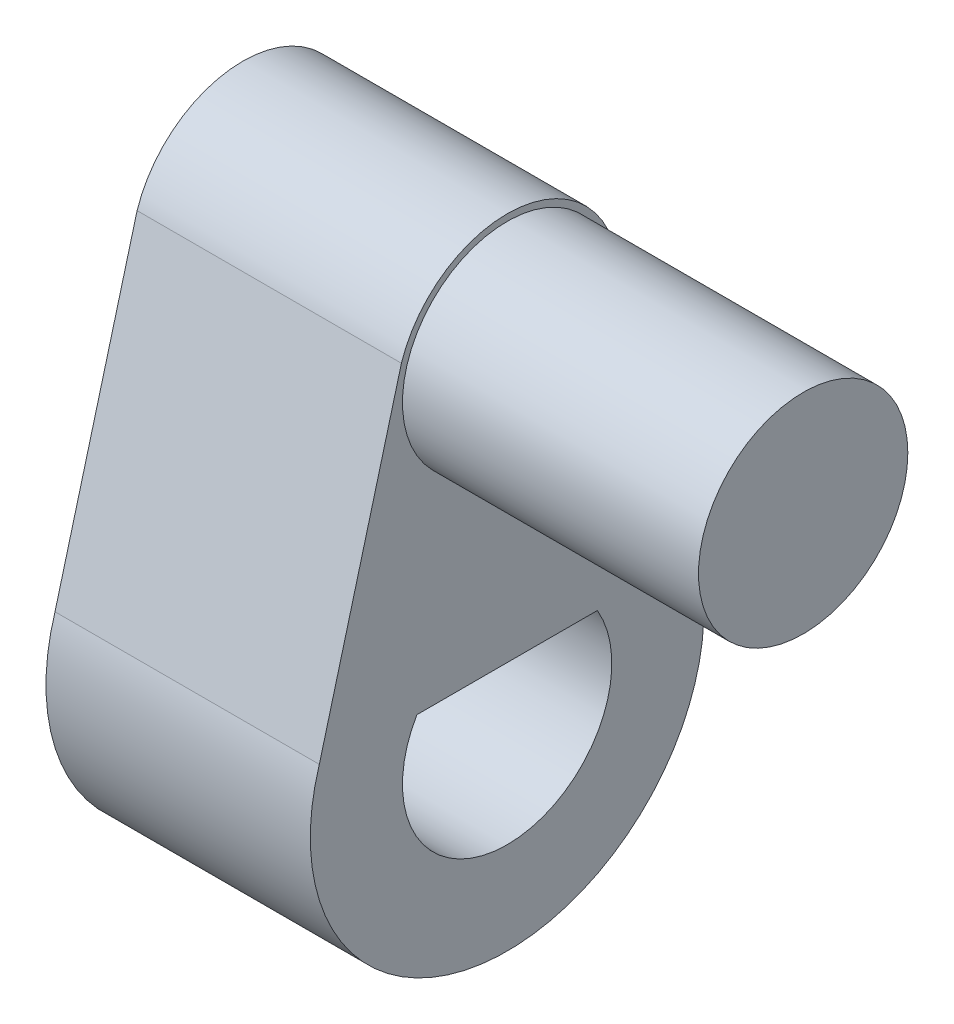
ISO-10303-21;
HEADER;
FILE_DESCRIPTION(('STEP AP214'),'2;1');
FILE_NAME('part.step','',(''),(''),'','','');
FILE_SCHEMA(('AUTOMOTIVE_DESIGN { 1 0 10303 214 1 1 1 1 }'));
ENDSEC;
DATA;
#1=APPLICATION_CONTEXT('core data for automotive mechanical design processes');
#2=APPLICATION_PROTOCOL_DEFINITION('international standard','automotive_design',2000,#1);
#3=PRODUCT_CONTEXT('',#1,'mechanical');
#4=PRODUCT('Part','Part','',(#3));
#5=PRODUCT_RELATED_PRODUCT_CATEGORY('part','',(#4));
#6=PRODUCT_DEFINITION_FORMATION('','',#4);
#7=PRODUCT_DEFINITION_CONTEXT('part definition',#1,'design');
#8=PRODUCT_DEFINITION('design','',#6,#7);
#9=PRODUCT_DEFINITION_SHAPE('','',#8);
#10=(LENGTH_UNIT() NAMED_UNIT(*) SI_UNIT(.MILLI.,.METRE.));
#11=(NAMED_UNIT(*) PLANE_ANGLE_UNIT() SI_UNIT($,.RADIAN.));
#12=(NAMED_UNIT(*) SI_UNIT($,.STERADIAN.) SOLID_ANGLE_UNIT());
#13=UNCERTAINTY_MEASURE_WITH_UNIT(LENGTH_MEASURE(1.E-05),#10,'distance_accuracy_value','');
#14=(GEOMETRIC_REPRESENTATION_CONTEXT(3) GLOBAL_UNCERTAINTY_ASSIGNED_CONTEXT((#13)) GLOBAL_UNIT_ASSIGNED_CONTEXT((#10,
#11,#12)) REPRESENTATION_CONTEXT('',''));
#15=CARTESIAN_POINT('',(0.,0.,0.));
#16=DIRECTION('',(0.,0.,1.));
#17=DIRECTION('',(1.,0.,0.));
#18=AXIS2_PLACEMENT_3D('',#15,#16,#17);
#19=CARTESIAN_POINT('',(2.5,30.6404275633658,53.6707737399797));
#20=DIRECTION('',(-1.,0.,0.));
#21=DIRECTION('',(0.,0.,1.));
#22=AXIS2_PLACEMENT_3D('',#19,#20,#21);
#23=CYLINDRICAL_SURFACE('',#22,1.05254228826987);
#24=CARTESIAN_POINT('',(0.,30.6404275633658,53.6707737399797));
#25=DIRECTION('',(1.,0.,0.));
#26=DIRECTION('',(0.,0.,-1.));
#27=AXIS2_PLACEMENT_3D('',#24,#25,#26);
#28=CIRCLE('',#27,1.05254228826987);
#29=CARTESIAN_POINT('',(0.,30.9688255971547,52.6707737399797));
#30=VERTEX_POINT('',#29);
#31=CARTESIAN_POINT('',(0.,30.9688255971547,54.6707737399797));
#32=VERTEX_POINT('',#31);
#33=EDGE_CURVE('E117',#30,#32,#28,.T.);
#34=ORIENTED_EDGE('',*,*,#33,.T.);
#35=DIRECTION('',(-1.,0.,0.));
#36=VECTOR('',#35,1.);
#37=CARTESIAN_POINT('',(2.5,30.9688255971547,54.6707737399797));
#38=LINE('',#37,#36);
#39=CARTESIAN_POINT('',(2.5,30.9688255971547,54.6707737399797));
#40=VERTEX_POINT('',#39);
#41=EDGE_CURVE('E107',#40,#32,#38,.T.);
#42=ORIENTED_EDGE('',*,*,#41,.F.);
#43=CARTESIAN_POINT('',(2.5,30.6404275633658,53.6707737399797));
#44=DIRECTION('',(1.,0.,0.));
#45=DIRECTION('',(0.,0.,-1.));
#46=AXIS2_PLACEMENT_3D('',#43,#44,#45);
#47=CIRCLE('',#46,1.05254228826987);
#48=CARTESIAN_POINT('',(2.5,30.9688255971547,52.6707737399797));
#49=VERTEX_POINT('',#48);
#50=EDGE_CURVE('E127',#49,#40,#47,.T.);
#51=ORIENTED_EDGE('',*,*,#50,.F.);
#52=DIRECTION('',(-1.,0.,0.));
#53=VECTOR('',#52,1.);
#54=CARTESIAN_POINT('',(2.5,30.9688255971547,52.6707737399797));
#55=LINE('',#54,#53);
#56=EDGE_CURVE('E136',#49,#30,#55,.T.);
#57=ORIENTED_EDGE('',*,*,#56,.T.);
#58=EDGE_LOOP('',(#34,#42,#51,#57));
#59=FACE_BOUND('',#58,.T.);
#60=ADVANCED_FACE('F36',(#59),#23,.T.);
#61=CARTESIAN_POINT('',(2.5,30.9688255971547,54.6707737399797));
#62=DIRECTION('',(0.,-0.258819045102522,-0.965925826289068));
#63=DIRECTION('',(0.,0.965925826289068,-0.258819045102522));
#64=AXIS2_PLACEMENT_3D('',#61,#62,#63);
#65=PLANE('',#64);
#66=DIRECTION('',(0.,-0.965925826289068,0.258819045102522));
#67=VECTOR('',#66,1.);
#68=CARTESIAN_POINT('',(0.,30.9688255971547,54.6707737399797));
#69=LINE('',#68,#67);
#70=CARTESIAN_POINT('',(0.,28.0710481182874,55.4472308752873));
#71=VERTEX_POINT('',#70);
#72=EDGE_CURVE('E121',#32,#71,#69,.T.);
#73=ORIENTED_EDGE('',*,*,#72,.T.);
#74=DIRECTION('',(-1.,0.,0.));
#75=VECTOR('',#74,1.);
#76=CARTESIAN_POINT('',(2.5,28.0710481182874,55.4472308752873));
#77=LINE('',#76,#75);
#78=CARTESIAN_POINT('',(2.5,28.0710481182874,55.4472308752873));
#79=VERTEX_POINT('',#78);
#80=EDGE_CURVE('E147',#79,#71,#77,.T.);
#81=ORIENTED_EDGE('',*,*,#80,.F.);
#82=DIRECTION('',(0.,-0.965925826289068,0.258819045102522));
#83=VECTOR('',#82,1.);
#84=CARTESIAN_POINT('',(2.5,30.9688255971547,54.6707737399797));
#85=LINE('',#84,#83);
#86=EDGE_CURVE('E130',#40,#79,#85,.T.);
#87=ORIENTED_EDGE('',*,*,#86,.F.);
#88=ORIENTED_EDGE('',*,*,#41,.T.);
#89=EDGE_LOOP('',(#73,#81,#87,#88));
#90=FACE_BOUND('',#89,.T.);
#91=ADVANCED_FACE('F171',(#90),#65,.F.);
#92=CARTESIAN_POINT('',(2.5,27.5141959960999,53.6707737399797));
#93=DIRECTION('',(-1.,0.,0.));
#94=DIRECTION('',(0.,0.,1.));
#95=AXIS2_PLACEMENT_3D('',#92,#93,#94);
#96=CYLINDRICAL_SURFACE('',#95,1.86168854526473);
#97=CARTESIAN_POINT('',(0.,27.5141959960999,53.6707737399797));
#98=DIRECTION('',(1.,0.,0.));
#99=DIRECTION('',(0.,0.,-1.));
#100=AXIS2_PLACEMENT_3D('',#97,#98,#99);
#101=CIRCLE('',#100,1.86168854526473);
#102=CARTESIAN_POINT('',(0.,28.0710481182874,51.8943166046722));
#103=VERTEX_POINT('',#102);
#104=EDGE_CURVE('E139',#71,#103,#101,.T.);
#105=ORIENTED_EDGE('',*,*,#104,.T.);
#106=DIRECTION('',(-1.,0.,0.));
#107=VECTOR('',#106,1.);
#108=CARTESIAN_POINT('',(2.5,28.0710481182874,51.8943166046722));
#109=LINE('',#108,#107);
#110=CARTESIAN_POINT('',(2.5,28.0710481182874,51.8943166046722));
#111=VERTEX_POINT('',#110);
#112=EDGE_CURVE('E144',#111,#103,#109,.T.);
#113=ORIENTED_EDGE('',*,*,#112,.F.);
#114=CARTESIAN_POINT('',(2.5,27.5141959960999,53.6707737399797));
#115=DIRECTION('',(1.,0.,0.));
#116=DIRECTION('',(0.,0.,-1.));
#117=AXIS2_PLACEMENT_3D('',#114,#115,#116);
#118=CIRCLE('',#117,1.86168854526473);
#119=EDGE_CURVE('E133',#79,#111,#118,.T.);
#120=ORIENTED_EDGE('',*,*,#119,.F.);
#121=ORIENTED_EDGE('',*,*,#80,.T.);
#122=EDGE_LOOP('',(#105,#113,#120,#121));
#123=FACE_BOUND('',#122,.T.);
#124=ADVANCED_FACE('F175',(#123),#96,.T.);
#125=CARTESIAN_POINT('',(2.5,30.9688255971547,52.6707737399797));
#126=DIRECTION('',(0.,-0.258819045102522,0.965925826289068));
#127=DIRECTION('',(0.,-0.965925826289068,-0.258819045102522));
#128=AXIS2_PLACEMENT_3D('',#125,#126,#127);
#129=PLANE('',#128);
#130=DIRECTION('',(0.,0.965925826289068,0.258819045102522));
#131=VECTOR('',#130,1.);
#132=CARTESIAN_POINT('',(0.,30.9688255971547,52.6707737399797));
#133=LINE('',#132,#131);
#134=EDGE_CURVE('E131',#103,#30,#133,.T.);
#135=ORIENTED_EDGE('',*,*,#134,.T.);
#136=ORIENTED_EDGE('',*,*,#56,.F.);
#137=DIRECTION('',(0.,0.965925826289068,0.258819045102522));
#138=VECTOR('',#137,1.);
#139=CARTESIAN_POINT('',(2.5,30.9688255971547,52.6707737399797));
#140=LINE('',#139,#138);
#141=EDGE_CURVE('E135',#111,#49,#140,.T.);
#142=ORIENTED_EDGE('',*,*,#141,.F.);
#143=ORIENTED_EDGE('',*,*,#112,.T.);
#144=EDGE_LOOP('',(#135,#136,#142,#143));
#145=FACE_BOUND('',#144,.T.);
#146=ADVANCED_FACE('F179',(#145),#129,.F.);
#147=CARTESIAN_POINT('',(2.5,30.6404275633658,53.6707737399797));
#148=DIRECTION('',(1.,0.,0.));
#149=DIRECTION('',(0.,0.,-1.));
#150=AXIS2_PLACEMENT_3D('',#147,#148,#149);
#151=PLANE('',#150);
#152=CARTESIAN_POINT('',(2.5,27.5141959960997,53.6707737399798));
#153=DIRECTION('',(1.,0.,0.));
#154=DIRECTION('',(0.,0.,-1.));
#155=AXIS2_PLACEMENT_3D('',#152,#153,#154);
#156=CIRCLE('',#155,0.989999999999993);
#157=CARTESIAN_POINT('',(2.5,28.0163959156241,54.5239415082585));
#158=VERTEX_POINT('',#157);
#159=CARTESIAN_POINT('',(2.5,28.0163959156241,52.8176059717011));
#160=VERTEX_POINT('',#159);
#161=EDGE_CURVE('E105',#158,#160,#156,.T.);
#162=ORIENTED_EDGE('',*,*,#161,.F.);
#163=DIRECTION('',(0.,0.,-1.));
#164=VECTOR('',#163,1.);
#165=CARTESIAN_POINT('',(2.5,28.0163959156241,54.6674353176535));
#166=LINE('',#165,#164);
#167=EDGE_CURVE('E110',#158,#160,#166,.T.);
#168=ORIENTED_EDGE('',*,*,#167,.T.);
#169=EDGE_LOOP('',(#162,#168));
#170=FACE_BOUND('',#169,.T.);
#171=CARTESIAN_POINT('',(2.5,30.6404275633658,53.6707737399797));
#172=DIRECTION('',(1.,0.,0.));
#173=DIRECTION('',(0.,0.,-1.));
#174=AXIS2_PLACEMENT_3D('',#171,#172,#173);
#175=CIRCLE('',#174,0.990000000000001);
#176=CARTESIAN_POINT('',(2.5,30.6404275633658,52.6807737399797));
#177=VERTEX_POINT('',#176);
#178=EDGE_CURVE('E113',#177,#177,#175,.T.);
#179=ORIENTED_EDGE('',*,*,#178,.F.);
#180=EDGE_LOOP('',(#179));
#181=FACE_BOUND('',#180,.T.);
#182=ORIENTED_EDGE('',*,*,#50,.T.);
#183=ORIENTED_EDGE('',*,*,#86,.T.);
#184=ORIENTED_EDGE('',*,*,#119,.T.);
#185=ORIENTED_EDGE('',*,*,#141,.T.);
#186=EDGE_LOOP('',(#182,#183,#184,#185));
#187=FACE_BOUND('',#186,.T.);
#188=ADVANCED_FACE('F115',(#170,#181,#187),#151,.T.);
#189=CARTESIAN_POINT('',(0.,30.6404275633658,53.6707737399797));
#190=DIRECTION('',(1.,0.,0.));
#191=DIRECTION('',(0.,0.,-1.));
#192=AXIS2_PLACEMENT_3D('',#189,#190,#191);
#193=PLANE('',#192);
#194=DIRECTION('',(0.,0.,1.));
#195=VECTOR('',#194,1.);
#196=CARTESIAN_POINT('',(0.,28.2163959156241,54.5239415082585));
#197=LINE('',#196,#195);
#198=CARTESIAN_POINT('',(0.,28.2163959156241,52.7100369013919));
#199=VERTEX_POINT('',#198);
#200=CARTESIAN_POINT('',(0.,28.2163959156241,54.6315105785678));
#201=VERTEX_POINT('',#200);
#202=EDGE_CURVE('E153',#199,#201,#197,.T.);
#203=ORIENTED_EDGE('',*,*,#202,.T.);
#204=CARTESIAN_POINT('',(0.,27.5141959960997,53.6707737399798));
#205=DIRECTION('',(1.,0.,0.));
#206=DIRECTION('',(0.,0.,-1.));
#207=AXIS2_PLACEMENT_3D('',#204,#205,#206);
#208=CIRCLE('',#207,1.18999999999999);
#209=EDGE_CURVE('E155',#201,#199,#208,.T.);
#210=ORIENTED_EDGE('',*,*,#209,.T.);
#211=EDGE_LOOP('',(#203,#210));
#212=FACE_BOUND('',#211,.T.);
#213=ORIENTED_EDGE('',*,*,#33,.F.);
#214=ORIENTED_EDGE('',*,*,#134,.F.);
#215=ORIENTED_EDGE('',*,*,#104,.F.);
#216=ORIENTED_EDGE('',*,*,#72,.F.);
#217=EDGE_LOOP('',(#213,#214,#215,#216));
#218=FACE_BOUND('',#217,.T.);
#219=ADVANCED_FACE('F184',(#212,#218),#193,.F.);
#220=CARTESIAN_POINT('',(0.,27.5141959960997,53.6707737399798));
#221=DIRECTION('',(1.,0.,0.));
#222=DIRECTION('',(0.,0.,-1.));
#223=AXIS2_PLACEMENT_3D('',#220,#221,#222);
#224=CYLINDRICAL_SURFACE('',#223,0.989999999999993);
#225=DIRECTION('',(1.,0.,0.));
#226=VECTOR('',#225,1.);
#227=CARTESIAN_POINT('',(0.,28.0163959156241,52.8176059717011));
#228=LINE('',#227,#226);
#229=CARTESIAN_POINT('',(0.2,28.0163959156241,52.8176059717011));
#230=VERTEX_POINT('',#229);
#231=EDGE_CURVE('E106',#160,#230,#228,.F.);
#232=ORIENTED_EDGE('',*,*,#231,.T.);
#233=CARTESIAN_POINT('',(0.2,27.5141959960997,53.6707737399798));
#234=DIRECTION('',(1.,0.,0.));
#235=DIRECTION('',(0.,0.,-1.));
#236=AXIS2_PLACEMENT_3D('',#233,#234,#235);
#237=CIRCLE('',#236,0.989999999999993);
#238=CARTESIAN_POINT('',(0.2,28.0163959156241,54.5239415082585));
#239=VERTEX_POINT('',#238);
#240=EDGE_CURVE('E50',#230,#239,#237,.F.);
#241=ORIENTED_EDGE('',*,*,#240,.T.);
#242=DIRECTION('',(1.,0.,0.));
#243=VECTOR('',#242,1.);
#244=CARTESIAN_POINT('',(0.,28.0163959156241,54.5239415082585));
#245=LINE('',#244,#243);
#246=EDGE_CURVE('E101',#239,#158,#245,.T.);
#247=ORIENTED_EDGE('',*,*,#246,.T.);
#248=ORIENTED_EDGE('',*,*,#161,.T.);
#249=EDGE_LOOP('',(#232,#241,#247,#248));
#250=FACE_BOUND('',#249,.T.);
#251=ADVANCED_FACE('F103',(#250),#224,.F.);
#252=CARTESIAN_POINT('',(5.3,30.6404275633658,53.6707737399797));
#253=DIRECTION('',(-1.,0.,0.));
#254=DIRECTION('',(0.,0.,1.));
#255=AXIS2_PLACEMENT_3D('',#252,#253,#254);
#256=CYLINDRICAL_SURFACE('',#255,0.990000000000001);
#257=CARTESIAN_POINT('',(5.3,30.6404275633658,53.6707737399797));
#258=DIRECTION('',(1.,0.,0.));
#259=DIRECTION('',(0.,0.,-1.));
#260=AXIS2_PLACEMENT_3D('',#257,#258,#259);
#261=CIRCLE('',#260,0.990000000000001);
#262=CARTESIAN_POINT('',(5.3,30.6404275633658,52.6807737399797));
#263=VERTEX_POINT('',#262);
#264=EDGE_CURVE('E118',#263,#263,#261,.T.);
#265=ORIENTED_EDGE('',*,*,#264,.F.);
#266=EDGE_LOOP('',(#265));
#267=FACE_BOUND('',#266,.T.);
#268=ORIENTED_EDGE('',*,*,#178,.T.);
#269=EDGE_LOOP('',(#268));
#270=FACE_BOUND('',#269,.T.);
#271=ADVANCED_FACE('F192',(#267,#270),#256,.T.);
#272=CARTESIAN_POINT('',(5.3,30.6404275633658,53.6707737399797));
#273=DIRECTION('',(1.,0.,0.));
#274=DIRECTION('',(0.,0.,-1.));
#275=AXIS2_PLACEMENT_3D('',#272,#273,#274);
#276=PLANE('',#275);
#277=ORIENTED_EDGE('',*,*,#264,.T.);
#278=EDGE_LOOP('',(#277));
#279=FACE_BOUND('',#278,.T.);
#280=ADVANCED_FACE('F195',(#279),#276,.T.);
#281=CARTESIAN_POINT('',(-2.16703056943876,28.0163959156241,54.6674353176535));
#282=DIRECTION('',(0.,-1.,0.));
#283=DIRECTION('',(0.,0.,-1.));
#284=AXIS2_PLACEMENT_3D('',#281,#282,#283);
#285=PLANE('',#284);
#286=ORIENTED_EDGE('',*,*,#246,.F.);
#287=DIRECTION('',(0.,0.,1.));
#288=VECTOR('',#287,1.);
#289=CARTESIAN_POINT('',(0.2,28.0163959156241,52.8176059717011));
#290=LINE('',#289,#288);
#291=EDGE_CURVE('E11',#239,#230,#290,.F.);
#292=ORIENTED_EDGE('',*,*,#291,.T.);
#293=ORIENTED_EDGE('',*,*,#231,.F.);
#294=ORIENTED_EDGE('',*,*,#167,.F.);
#295=EDGE_LOOP('',(#286,#292,#293,#294));
#296=FACE_BOUND('',#295,.T.);
#297=ADVANCED_FACE('F111',(#296),#285,.T.);
#298=CARTESIAN_POINT('',(0.2,28.2163959156241,53.6707737399797));
#299=DIRECTION('',(0.,0.,-1.));
#300=DIRECTION('',(-1.,0.,0.));
#301=AXIS2_PLACEMENT_3D('',#298,#299,#300);
#302=CYLINDRICAL_SURFACE('',#301,0.2);
#303=CARTESIAN_POINT('',(0.2,28.0163959156241,52.8176059717011));
#304=CARTESIAN_POINT('',(0.189772357512643,28.0163827461637,52.8176147868145));
#305=CARTESIAN_POINT('',(0.179557025954626,28.0171794869231,52.8171579500498));
#306=CARTESIAN_POINT('',(0.159480506417387,28.0202851473706,52.8153843990222));
#307=CARTESIAN_POINT('',(0.149617944812023,28.0225873222219,52.8140715201828));
#308=CARTESIAN_POINT('',(0.130489650722654,28.0285950089652,52.8106578234832));
#309=CARTESIAN_POINT('',(0.121223351505569,28.0322991645486,52.8085577671755));
#310=CARTESIAN_POINT('',(0.103479486426053,28.0409500335728,52.8036773085589));
#311=CARTESIAN_POINT('',(0.095002629131713,28.0458978488133,52.8008963030311));
#312=CARTESIAN_POINT('',(0.0785594278675043,28.0571575069703,52.7946044427444));
#313=CARTESIAN_POINT('',(0.0706462909463444,28.0635291111987,52.791062010407));
#314=CARTESIAN_POINT('',(0.0559907466998367,28.0772478387994,52.7834875743008));
#315=CARTESIAN_POINT('',(0.0492486860461361,28.0845952499059,52.7794554261605));
#316=CARTESIAN_POINT('',(0.036245786194352,28.1010371646158,52.7704995155165));
#317=CARTESIAN_POINT('',(0.0301494236702358,28.1102352921937,52.7655272495045));
#318=CARTESIAN_POINT('',(0.0195929108946618,28.1293738070536,52.7552723392696));
#319=CARTESIAN_POINT('',(0.0151340746689806,28.1393147827667,52.7499894497143));
#320=CARTESIAN_POINT('',(0.00785203697195295,28.1598336807001,52.7391822273171));
#321=CARTESIAN_POINT('',(0.00505106880596439,28.1704182498175,52.7336556357393));
#322=CARTESIAN_POINT('',(0.00121312094263996,28.1918603704444,52.7225601247676));
#323=CARTESIAN_POINT('',(0.000172406162618362,28.2027172942056,52.7169913202483));
#324=CARTESIAN_POINT('',(6.55167424093648E-06,28.2145249157657,52.7109872234583));
#325=CARTESIAN_POINT('',(-1.42508036722267E-08,28.2154604009842,52.710511891717));
#326=CARTESIAN_POINT('',(0.,28.2163959156241,52.7100369013919));
#327=B_SPLINE_CURVE_WITH_KNOTS('',3,(#303,#304,#305,#306,#307,#308,#309,#310,#311,#312,#313,
#314,#315,#316,#317,#318,#319,#320,#321,#322,#323,#324,#325,#326),.UNSPECIFIED.,.F.,.F.,(4,2,2,
2,2,2,2,2,2,2,2,4),(0.,0.0306224208694961,0.0611085747210697,0.0915653106350277,
0.122049124886549,0.154198674296258,0.186357724720407,0.222521484699059,0.258714201046618,
0.295381895067916,0.331971685824275,0.335119613660454),.UNSPECIFIED.);
#328=EDGE_CURVE('E158',#230,#199,#327,.T.);
#329=ORIENTED_EDGE('',*,*,#328,.F.);
#330=ORIENTED_EDGE('',*,*,#291,.F.);
#331=CARTESIAN_POINT('',(0.2,28.0163959156241,54.5239415082585));
#332=CARTESIAN_POINT('',(0.189772357512643,28.0163827461637,54.5239326931452));
#333=CARTESIAN_POINT('',(0.179557025954626,28.0171794869231,54.5243895299098));
#334=CARTESIAN_POINT('',(0.159480506417387,28.0202851473706,54.5261630809375));
#335=CARTESIAN_POINT('',(0.149617944812023,28.0225873222219,54.5274759597768));
#336=CARTESIAN_POINT('',(0.130489650722654,28.0285950089652,54.5308896564764));
#337=CARTESIAN_POINT('',(0.12122335150557,28.0322991645486,54.5329897127841));
#338=CARTESIAN_POINT('',(0.103479486426054,28.0409500335728,54.5378701714007));
#339=CARTESIAN_POINT('',(0.0950026291317135,28.0458978488133,54.5406511769286));
#340=CARTESIAN_POINT('',(0.0785594278675042,28.0571575069703,54.5469430372153));
#341=CARTESIAN_POINT('',(0.0706462909463443,28.0635291111987,54.5504854695526));
#342=CARTESIAN_POINT('',(0.0559907466998367,28.0772478387994,54.5580599056588));
#343=CARTESIAN_POINT('',(0.0492486860461361,28.0845952499059,54.5620920537992));
#344=CARTESIAN_POINT('',(0.036245786194352,28.1010371646158,54.5710479644432));
#345=CARTESIAN_POINT('',(0.0301494236702358,28.1102352921937,54.5760202304552));
#346=CARTESIAN_POINT('',(0.0195929108946617,28.1293738070536,54.5862751406901));
#347=CARTESIAN_POINT('',(0.0151340746689804,28.1393147827667,54.5915580302454));
#348=CARTESIAN_POINT('',(0.00785203697195153,28.1598336807001,54.6023652526425));
#349=CARTESIAN_POINT('',(0.00505106880596251,28.1704182498175,54.6078918442204));
#350=CARTESIAN_POINT('',(0.00121312094263952,28.1918603704444,54.6189873551921));
#351=CARTESIAN_POINT('',(0.000172406162618332,28.2027172942056,54.6245561597114));
#352=CARTESIAN_POINT('',(6.55167424093349E-06,28.2145249157657,54.6305602565014));
#353=CARTESIAN_POINT('',(-1.42508036753759E-08,28.2154604009842,54.6310355882426));
#354=CARTESIAN_POINT('',(0.,28.2163959156241,54.6315105785678));
#355=B_SPLINE_CURVE_WITH_KNOTS('',3,(#331,#332,#333,#334,#335,#336,#337,#338,#339,#340,#341,
#342,#343,#344,#345,#346,#347,#348,#349,#350,#351,#352,#353,#354),.UNSPECIFIED.,.F.,.F.,(4,2,2,
2,2,2,2,2,2,2,2,4),(0.,0.0306224208694961,0.0611085747210697,0.0915653106350264,
0.122049124886549,0.154198674296257,0.186357724720407,0.222521484699058,0.258714201046618,
0.295381895067931,0.331971685824274,0.335119613660454),.UNSPECIFIED.);
#356=EDGE_CURVE('E41',#201,#239,#355,.F.);
#357=ORIENTED_EDGE('',*,*,#356,.F.);
#358=ORIENTED_EDGE('',*,*,#202,.F.);
#359=EDGE_LOOP('',(#329,#330,#357,#358));
#360=FACE_BOUND('',#359,.T.);
#361=ADVANCED_FACE('F163',(#360),#302,.T.);
#362=CARTESIAN_POINT('',(0.2,27.5141959960997,53.6707737399798));
#363=DIRECTION('',(1.,0.,0.));
#364=DIRECTION('',(0.,0.,-1.));
#365=AXIS2_PLACEMENT_3D('',#362,#363,#364);
#366=TOROIDAL_SURFACE('',#365,1.18999999999999,0.2);
#367=ORIENTED_EDGE('',*,*,#356,.T.);
#368=ORIENTED_EDGE('',*,*,#240,.F.);
#369=ORIENTED_EDGE('',*,*,#328,.T.);
#370=ORIENTED_EDGE('',*,*,#209,.F.);
#371=EDGE_LOOP('',(#367,#368,#369,#370));
#372=FACE_BOUND('',#371,.T.);
#373=ADVANCED_FACE('F38',(#372),#366,.T.);
#374=CLOSED_SHELL('',(#60,#91,#124,#146,#188,#219,#251,#271,#280,#297,#361,#373));
#375=MANIFOLD_SOLID_BREP('B2',#374);
#376=ADVANCED_BREP_SHAPE_REPRESENTATION('',(#18,#375),#14);
#377=SHAPE_DEFINITION_REPRESENTATION(#9,#376);
ENDSEC;
END-ISO-10303-21;
